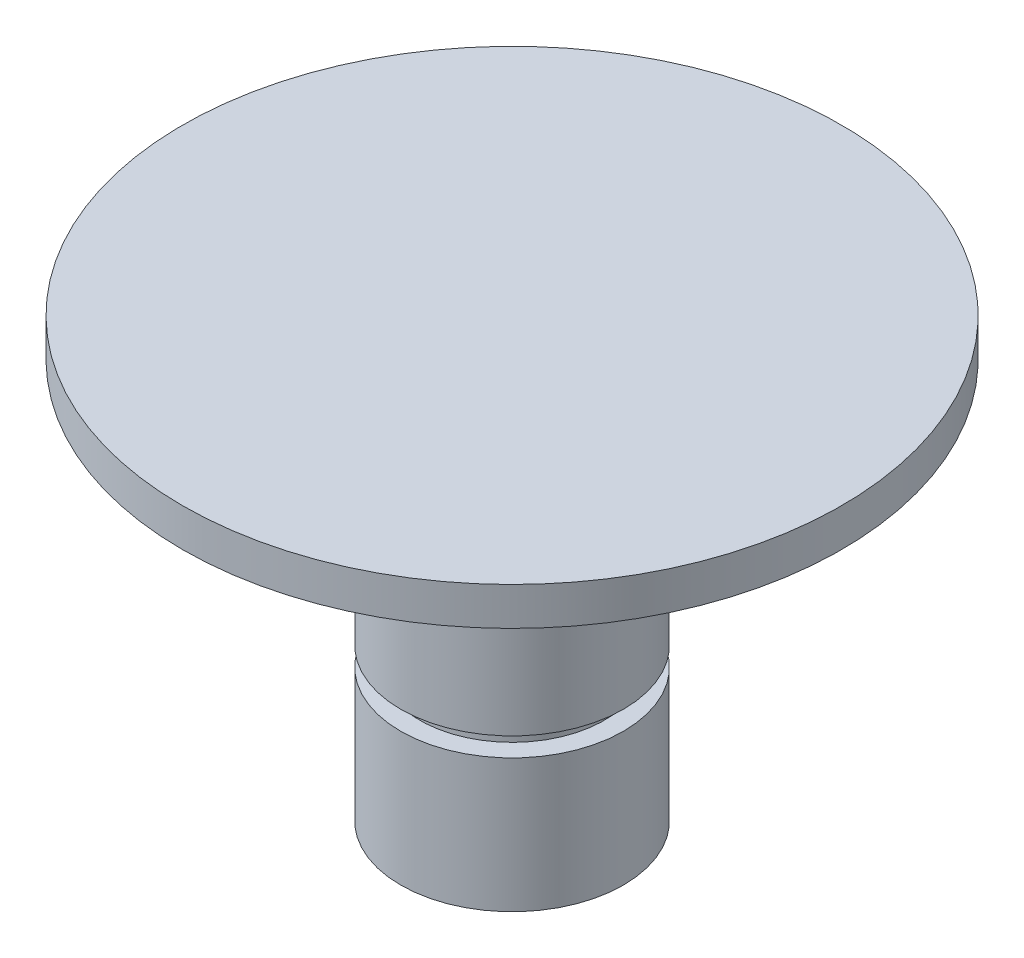
ISO-10303-21;
HEADER;
FILE_DESCRIPTION(('STEP AP214'),'2;1');
FILE_NAME('part.step','',(''),(''),'','','');
FILE_SCHEMA(('AUTOMOTIVE_DESIGN { 1 0 10303 214 1 1 1 1 }'));
ENDSEC;
DATA;
#1=APPLICATION_CONTEXT('core data for automotive mechanical design processes');
#2=APPLICATION_PROTOCOL_DEFINITION('international standard','automotive_design',2000,#1);
#3=PRODUCT_CONTEXT('',#1,'mechanical');
#4=PRODUCT('Part','Part','',(#3));
#5=PRODUCT_RELATED_PRODUCT_CATEGORY('part','',(#4));
#6=PRODUCT_DEFINITION_FORMATION('','',#4);
#7=PRODUCT_DEFINITION_CONTEXT('part definition',#1,'design');
#8=PRODUCT_DEFINITION('design','',#6,#7);
#9=PRODUCT_DEFINITION_SHAPE('','',#8);
#10=(LENGTH_UNIT() NAMED_UNIT(*) SI_UNIT(.MILLI.,.METRE.));
#11=(NAMED_UNIT(*) PLANE_ANGLE_UNIT() SI_UNIT($,.RADIAN.));
#12=(NAMED_UNIT(*) SI_UNIT($,.STERADIAN.) SOLID_ANGLE_UNIT());
#13=UNCERTAINTY_MEASURE_WITH_UNIT(LENGTH_MEASURE(1.E-05),#10,'distance_accuracy_value','');
#14=(GEOMETRIC_REPRESENTATION_CONTEXT(3) GLOBAL_UNCERTAINTY_ASSIGNED_CONTEXT((#13)) GLOBAL_UNIT_ASSIGNED_CONTEXT((#10,
#11,#12)) REPRESENTATION_CONTEXT('',''));
#15=CARTESIAN_POINT('',(0.,0.,0.));
#16=DIRECTION('',(0.,0.,1.));
#17=DIRECTION('',(1.,0.,0.));
#18=AXIS2_PLACEMENT_3D('',#15,#16,#17);
#19=CARTESIAN_POINT('',(0.,21.,0.));
#20=DIRECTION('',(0.,-1.,0.));
#21=DIRECTION('',(0.,0.,-1.));
#22=AXIS2_PLACEMENT_3D('',#19,#20,#21);
#23=CYLINDRICAL_SURFACE('',#22,5.85);
#24=CARTESIAN_POINT('',(0.,18.,0.));
#25=DIRECTION('',(0.,-1.,0.));
#26=DIRECTION('',(0.,0.,-1.));
#27=AXIS2_PLACEMENT_3D('',#24,#25,#26);
#28=CIRCLE('',#27,5.85);
#29=CARTESIAN_POINT('',(0.,18.,-5.85));
#30=VERTEX_POINT('',#29);
#31=EDGE_CURVE('E82',#30,#30,#28,.T.);
#32=CARTESIAN_POINT('',(0.,8.,0.));
#33=DIRECTION('',(0.,-1.,0.));
#34=DIRECTION('',(0.,0.,-1.));
#35=AXIS2_PLACEMENT_3D('',#32,#33,#34);
#36=CIRCLE('',#35,5.85);
#37=CARTESIAN_POINT('',(0.,8.,-5.85));
#38=VERTEX_POINT('',#37);
#39=EDGE_CURVE('E62',#38,#38,#36,.T.);
#40=CARTESIAN_POINT('',(0.,18.,-5.85));
#41=CARTESIAN_POINT('',(0.,17.8958333333333,-5.85));
#42=CARTESIAN_POINT('',(0.,17.7916666666667,-5.85));
#43=CARTESIAN_POINT('',(0.,17.5833333333333,-5.85));
#44=CARTESIAN_POINT('',(0.,17.4791666666667,-5.85));
#45=CARTESIAN_POINT('',(0.,17.2708333333333,-5.85));
#46=CARTESIAN_POINT('',(0.,17.1666666666667,-5.85));
#47=CARTESIAN_POINT('',(0.,16.9583333333333,-5.85));
#48=CARTESIAN_POINT('',(0.,16.8541666666667,-5.85));
#49=CARTESIAN_POINT('',(0.,16.6458333333333,-5.85));
#50=CARTESIAN_POINT('',(0.,16.5416666666667,-5.85));
#51=CARTESIAN_POINT('',(0.,16.3333333333333,-5.85));
#52=CARTESIAN_POINT('',(0.,16.2291666666667,-5.85));
#53=CARTESIAN_POINT('',(0.,16.0208333333333,-5.85));
#54=CARTESIAN_POINT('',(0.,15.9166666666667,-5.85));
#55=CARTESIAN_POINT('',(0.,15.7083333333333,-5.85));
#56=CARTESIAN_POINT('',(0.,15.6041666666667,-5.85));
#57=CARTESIAN_POINT('',(0.,15.3958333333333,-5.85));
#58=CARTESIAN_POINT('',(0.,15.2916666666667,-5.85));
#59=CARTESIAN_POINT('',(0.,15.0833333333333,-5.85));
#60=CARTESIAN_POINT('',(0.,14.9791666666667,-5.85));
#61=CARTESIAN_POINT('',(0.,14.7708333333333,-5.85));
#62=CARTESIAN_POINT('',(0.,14.6666666666667,-5.85));
#63=CARTESIAN_POINT('',(0.,14.4583333333333,-5.85));
#64=CARTESIAN_POINT('',(0.,14.3541666666667,-5.85));
#65=CARTESIAN_POINT('',(0.,14.1458333333333,-5.85));
#66=CARTESIAN_POINT('',(0.,14.0416666666667,-5.85));
#67=CARTESIAN_POINT('',(0.,13.8333333333333,-5.85));
#68=CARTESIAN_POINT('',(0.,13.7291666666667,-5.85));
#69=CARTESIAN_POINT('',(0.,13.5208333333333,-5.85));
#70=CARTESIAN_POINT('',(0.,13.4166666666667,-5.85));
#71=CARTESIAN_POINT('',(0.,13.2083333333333,-5.85));
#72=CARTESIAN_POINT('',(0.,13.1041666666667,-5.85));
#73=CARTESIAN_POINT('',(0.,12.8958333333333,-5.85));
#74=CARTESIAN_POINT('',(0.,12.7916666666667,-5.85));
#75=CARTESIAN_POINT('',(0.,12.5833333333333,-5.85));
#76=CARTESIAN_POINT('',(0.,12.4791666666667,-5.85));
#77=CARTESIAN_POINT('',(0.,12.2708333333333,-5.85));
#78=CARTESIAN_POINT('',(0.,12.1666666666667,-5.85));
#79=CARTESIAN_POINT('',(0.,11.9583333333333,-5.85));
#80=CARTESIAN_POINT('',(0.,11.8541666666667,-5.85));
#81=CARTESIAN_POINT('',(0.,11.6458333333333,-5.85));
#82=CARTESIAN_POINT('',(0.,11.5416666666667,-5.85));
#83=CARTESIAN_POINT('',(0.,11.3333333333333,-5.85));
#84=CARTESIAN_POINT('',(0.,11.2291666666667,-5.85));
#85=CARTESIAN_POINT('',(0.,11.0208333333333,-5.85));
#86=CARTESIAN_POINT('',(0.,10.9166666666667,-5.85));
#87=CARTESIAN_POINT('',(0.,10.7083333333333,-5.85));
#88=CARTESIAN_POINT('',(0.,10.6041666666667,-5.85));
#89=CARTESIAN_POINT('',(0.,10.3958333333333,-5.85));
#90=CARTESIAN_POINT('',(0.,10.2916666666667,-5.85));
#91=CARTESIAN_POINT('',(0.,10.0833333333333,-5.85));
#92=CARTESIAN_POINT('',(0.,9.97916666666667,-5.85));
#93=CARTESIAN_POINT('',(0.,9.77083333333334,-5.85));
#94=CARTESIAN_POINT('',(0.,9.66666666666667,-5.85));
#95=CARTESIAN_POINT('',(0.,9.45833333333334,-5.85));
#96=CARTESIAN_POINT('',(0.,9.35416666666667,-5.85));
#97=CARTESIAN_POINT('',(0.,9.14583333333334,-5.85));
#98=CARTESIAN_POINT('',(0.,9.04166666666667,-5.85));
#99=CARTESIAN_POINT('',(0.,8.83333333333334,-5.85));
#100=CARTESIAN_POINT('',(0.,8.72916666666667,-5.85));
#101=CARTESIAN_POINT('',(0.,8.52083333333334,-5.85));
#102=CARTESIAN_POINT('',(0.,8.41666666666667,-5.85));
#103=CARTESIAN_POINT('',(0.,8.20833333333334,-5.85));
#104=CARTESIAN_POINT('',(0.,8.10416666666667,-5.85));
#105=CARTESIAN_POINT('',(0.,8.,-5.85));
#106=B_SPLINE_CURVE_WITH_KNOTS('',3,(#40,#41,#42,#43,#44,#45,#46,#47,#48,#49,#50,#51,#52,#53,
#54,#55,#56,#57,#58,#59,#60,#61,#62,#63,#64,#65,#66,#67,#68,#69,#70,#71,#72,#73,#74,#75,#76,#77,
#78,#79,#80,#81,#82,#83,#84,#85,#86,#87,#88,#89,#90,#91,#92,#93,#94,#95,#96,#97,#98,#99,#100,
#101,#102,#103,#104,#105),.UNSPECIFIED.,.F.,.F.,(4,2,2,2,2,2,2,2,2,2,2,2,2,2,2,2,2,2,2,2,2,2,2,
2,2,2,2,2,2,2,2,2,4),(0.,0.3125,0.625000000000001,0.937500000000001,1.25,1.5625,1.875,2.1875,
2.5,2.8125,3.125,3.4375,3.75,4.0625,4.375,4.6875,5.,5.3125,5.625,5.9375,6.25,6.5625,6.875,
7.1875,7.5,7.8125,8.125,8.4375,8.75,9.0625,9.375,9.6875,10.),.UNSPECIFIED.);
#107=EDGE_CURVE('BSEAM41',#30,#38,#106,.T.);
#108=ORIENTED_EDGE('',*,*,#31,.T.);
#109=ORIENTED_EDGE('',*,*,#39,.F.);
#110=ORIENTED_EDGE('',*,*,#107,.T.);
#111=ORIENTED_EDGE('',*,*,#107,.F.);
#112=EDGE_LOOP('',(#108,#110,#109,#111));
#113=FACE_BOUND('',#112,.T.);
#114=ADVANCED_FACE('F41',(#113),#23,.T.);
#115=CARTESIAN_POINT('',(0.,7.,0.));
#116=DIRECTION('',(0.,-1.,0.));
#117=DIRECTION('',(0.,0.,-1.));
#118=AXIS2_PLACEMENT_3D('',#115,#116,#117);
#119=PLANE('',#118);
#120=CARTESIAN_POINT('',(0.,7.,0.));
#121=DIRECTION('',(0.,-1.,0.));
#122=DIRECTION('',(0.,0.,-1.));
#123=AXIS2_PLACEMENT_3D('',#120,#121,#122);
#124=CIRCLE('',#123,5.85);
#125=CARTESIAN_POINT('',(0.,7.,-5.85));
#126=VERTEX_POINT('',#125);
#127=EDGE_CURVE('E60',#126,#126,#124,.T.);
#128=ORIENTED_EDGE('',*,*,#127,.F.);
#129=EDGE_LOOP('',(#128));
#130=FACE_BOUND('',#129,.T.);
#131=CARTESIAN_POINT('',(0.,7.,0.));
#132=DIRECTION('',(0.,-1.,0.));
#133=DIRECTION('',(0.,0.,-1.));
#134=AXIS2_PLACEMENT_3D('',#131,#132,#133);
#135=CIRCLE('',#134,4.85);
#136=CARTESIAN_POINT('',(0.,7.,-4.85));
#137=VERTEX_POINT('',#136);
#138=EDGE_CURVE('E65',#137,#137,#135,.T.);
#139=ORIENTED_EDGE('',*,*,#138,.T.);
#140=EDGE_LOOP('',(#139));
#141=FACE_BOUND('',#140,.T.);
#142=ADVANCED_FACE('F105',(#130,#141),#119,.F.);
#143=CARTESIAN_POINT('',(0.,8.,0.));
#144=DIRECTION('',(0.,-1.,0.));
#145=DIRECTION('',(0.,0.,-1.));
#146=AXIS2_PLACEMENT_3D('',#143,#144,#145);
#147=PLANE('',#146);
#148=ORIENTED_EDGE('',*,*,#39,.T.);
#149=EDGE_LOOP('',(#148));
#150=FACE_BOUND('',#149,.T.);
#151=CARTESIAN_POINT('',(0.,8.,0.));
#152=DIRECTION('',(0.,-1.,0.));
#153=DIRECTION('',(0.,0.,-1.));
#154=AXIS2_PLACEMENT_3D('',#151,#152,#153);
#155=CIRCLE('',#154,4.85);
#156=CARTESIAN_POINT('',(0.,8.,-4.85));
#157=VERTEX_POINT('',#156);
#158=EDGE_CURVE('E68',#157,#157,#155,.T.);
#159=ORIENTED_EDGE('',*,*,#158,.F.);
#160=EDGE_LOOP('',(#159));
#161=FACE_BOUND('',#160,.T.);
#162=ADVANCED_FACE('F109',(#150,#161),#147,.T.);
#163=CARTESIAN_POINT('',(0.,7.,0.));
#164=DIRECTION('',(0.,1.,0.));
#165=DIRECTION('',(0.,0.,1.));
#166=AXIS2_PLACEMENT_3D('',#163,#164,#165);
#167=CYLINDRICAL_SURFACE('',#166,4.85);
#168=ORIENTED_EDGE('',*,*,#138,.F.);
#169=EDGE_LOOP('',(#168));
#170=FACE_BOUND('',#169,.T.);
#171=ORIENTED_EDGE('',*,*,#158,.T.);
#172=EDGE_LOOP('',(#171));
#173=FACE_BOUND('',#172,.T.);
#174=ADVANCED_FACE('F121',(#170,#173),#167,.T.);
#175=CARTESIAN_POINT('',(0.,0.,0.));
#176=DIRECTION('',(0.,1.,0.));
#177=DIRECTION('',(0.,0.,1.));
#178=AXIS2_PLACEMENT_3D('',#175,#176,#177);
#179=PLANE('',#178);
#180=CARTESIAN_POINT('',(0.,0.,0.));
#181=DIRECTION('',(0.,-1.,0.));
#182=DIRECTION('',(0.,0.,-1.));
#183=AXIS2_PLACEMENT_3D('',#180,#181,#182);
#184=CIRCLE('',#183,1.5);
#185=CARTESIAN_POINT('',(0.,0.,-1.5));
#186=VERTEX_POINT('',#185);
#187=EDGE_CURVE('E74',#186,#186,#184,.T.);
#188=ORIENTED_EDGE('',*,*,#187,.F.);
#189=EDGE_LOOP('',(#188));
#190=FACE_BOUND('',#189,.T.);
#191=CARTESIAN_POINT('',(0.,0.,0.));
#192=DIRECTION('',(0.,1.,0.));
#193=DIRECTION('',(0.,0.,1.));
#194=AXIS2_PLACEMENT_3D('',#191,#192,#193);
#195=CIRCLE('',#194,5.85);
#196=CARTESIAN_POINT('',(0.,0.,-5.85));
#197=VERTEX_POINT('',#196);
#198=EDGE_CURVE('E48',#197,#197,#195,.T.);
#199=ORIENTED_EDGE('',*,*,#198,.F.);
#200=EDGE_LOOP('',(#199));
#201=FACE_BOUND('',#200,.T.);
#202=ADVANCED_FACE('F113',(#190,#201),#179,.F.);
#203=CARTESIAN_POINT('',(0.,7.,-5.85));
#204=CARTESIAN_POINT('',(0.,6.92708333333333,-5.85));
#205=CARTESIAN_POINT('',(0.,6.85416666666667,-5.85));
#206=CARTESIAN_POINT('',(0.,6.70833333333333,-5.85));
#207=CARTESIAN_POINT('',(0.,6.63541666666667,-5.85));
#208=CARTESIAN_POINT('',(0.,6.48958333333333,-5.85));
#209=CARTESIAN_POINT('',(0.,6.41666666666667,-5.85));
#210=CARTESIAN_POINT('',(0.,6.27083333333333,-5.85));
#211=CARTESIAN_POINT('',(0.,6.19791666666667,-5.85));
#212=CARTESIAN_POINT('',(0.,6.05208333333333,-5.85));
#213=CARTESIAN_POINT('',(0.,5.97916666666667,-5.85));
#214=CARTESIAN_POINT('',(0.,5.83333333333333,-5.85));
#215=CARTESIAN_POINT('',(0.,5.76041666666667,-5.85));
#216=CARTESIAN_POINT('',(0.,5.61458333333333,-5.85));
#217=CARTESIAN_POINT('',(0.,5.54166666666667,-5.85));
#218=CARTESIAN_POINT('',(0.,5.39583333333333,-5.85));
#219=CARTESIAN_POINT('',(0.,5.32291666666667,-5.85));
#220=CARTESIAN_POINT('',(0.,5.17708333333333,-5.85));
#221=CARTESIAN_POINT('',(0.,5.10416666666667,-5.85));
#222=CARTESIAN_POINT('',(0.,4.95833333333333,-5.85));
#223=CARTESIAN_POINT('',(0.,4.88541666666667,-5.85));
#224=CARTESIAN_POINT('',(0.,4.73958333333333,-5.85));
#225=CARTESIAN_POINT('',(0.,4.66666666666667,-5.85));
#226=CARTESIAN_POINT('',(0.,4.52083333333333,-5.85));
#227=CARTESIAN_POINT('',(0.,4.44791666666667,-5.85));
#228=CARTESIAN_POINT('',(0.,4.30208333333333,-5.85));
#229=CARTESIAN_POINT('',(0.,4.22916666666667,-5.85));
#230=CARTESIAN_POINT('',(0.,4.08333333333333,-5.85));
#231=CARTESIAN_POINT('',(0.,4.01041666666667,-5.85));
#232=CARTESIAN_POINT('',(0.,3.86458333333334,-5.85));
#233=CARTESIAN_POINT('',(0.,3.79166666666667,-5.85));
#234=CARTESIAN_POINT('',(0.,3.64583333333333,-5.85));
#235=CARTESIAN_POINT('',(0.,3.57291666666667,-5.85));
#236=CARTESIAN_POINT('',(0.,3.42708333333334,-5.85));
#237=CARTESIAN_POINT('',(0.,3.35416666666667,-5.85));
#238=CARTESIAN_POINT('',(0.,3.20833333333333,-5.85));
#239=CARTESIAN_POINT('',(0.,3.13541666666667,-5.85));
#240=CARTESIAN_POINT('',(0.,2.98958333333333,-5.85));
#241=CARTESIAN_POINT('',(0.,2.91666666666667,-5.85));
#242=CARTESIAN_POINT('',(0.,2.77083333333333,-5.85));
#243=CARTESIAN_POINT('',(0.,2.69791666666667,-5.85));
#244=CARTESIAN_POINT('',(0.,2.55208333333334,-5.85));
#245=CARTESIAN_POINT('',(0.,2.47916666666667,-5.85));
#246=CARTESIAN_POINT('',(0.,2.33333333333334,-5.85));
#247=CARTESIAN_POINT('',(0.,2.26041666666667,-5.85));
#248=CARTESIAN_POINT('',(0.,2.11458333333334,-5.85));
#249=CARTESIAN_POINT('',(0.,2.04166666666667,-5.85));
#250=CARTESIAN_POINT('',(0.,1.89583333333334,-5.85));
#251=CARTESIAN_POINT('',(0.,1.82291666666667,-5.85));
#252=CARTESIAN_POINT('',(0.,1.67708333333333,-5.85));
#253=CARTESIAN_POINT('',(0.,1.60416666666667,-5.85));
#254=CARTESIAN_POINT('',(0.,1.45833333333333,-5.85));
#255=CARTESIAN_POINT('',(0.,1.38541666666667,-5.85));
#256=CARTESIAN_POINT('',(0.,1.23958333333333,-5.85));
#257=CARTESIAN_POINT('',(0.,1.16666666666667,-5.85));
#258=CARTESIAN_POINT('',(0.,1.02083333333333,-5.85));
#259=CARTESIAN_POINT('',(0.,0.947916666666667,-5.85));
#260=CARTESIAN_POINT('',(0.,0.802083333333334,-5.85));
#261=CARTESIAN_POINT('',(0.,0.729166666666667,-5.85));
#262=CARTESIAN_POINT('',(0.,0.583333333333334,-5.85));
#263=CARTESIAN_POINT('',(0.,0.510416666666667,-5.85));
#264=CARTESIAN_POINT('',(0.,0.364583333333334,-5.85));
#265=CARTESIAN_POINT('',(0.,0.291666666666667,-5.85));
#266=CARTESIAN_POINT('',(0.,0.145833333333333,-5.85));
#267=CARTESIAN_POINT('',(0.,0.0729166666666666,-5.85));
#268=CARTESIAN_POINT('',(0.,0.,-5.85));
#269=B_SPLINE_CURVE_WITH_KNOTS('',3,(#203,#204,#205,#206,#207,#208,#209,#210,#211,#212,#213,
#214,#215,#216,#217,#218,#219,#220,#221,#222,#223,#224,#225,#226,#227,#228,#229,#230,#231,#232,
#233,#234,#235,#236,#237,#238,#239,#240,#241,#242,#243,#244,#245,#246,#247,#248,#249,#250,#251,
#252,#253,#254,#255,#256,#257,#258,#259,#260,#261,#262,#263,#264,#265,#266,#267,#268),
.UNSPECIFIED.,.F.,.F.,(4,2,2,2,2,2,2,2,2,2,2,2,2,2,2,2,2,2,2,2,2,2,2,2,2,2,2,2,2,2,2,2,4),(0.,
0.21875,0.4375,0.656250000000001,0.875000000000001,1.09375,1.3125,1.53125,1.75,1.96875,2.1875,
2.40625,2.625,2.84375,3.0625,3.28125,3.5,3.71875,3.9375,4.15625,4.375,4.59375,4.8125,5.03125,
5.25,5.46875,5.6875,5.90625,6.125,6.34375,6.5625,6.78125,7.),.UNSPECIFIED.);
#270=EDGE_CURVE('BSEAM43',#126,#197,#269,.T.);
#271=ORIENTED_EDGE('',*,*,#127,.T.);
#272=ORIENTED_EDGE('',*,*,#198,.T.);
#273=ORIENTED_EDGE('',*,*,#270,.T.);
#274=ORIENTED_EDGE('',*,*,#270,.F.);
#275=EDGE_LOOP('',(#271,#273,#272,#274));
#276=FACE_BOUND('',#275,.T.);
#277=ADVANCED_FACE('F43',(#276),#23,.T.);
#278=CARTESIAN_POINT('',(0.,5.,0.));
#279=DIRECTION('',(0.,-1.,0.));
#280=DIRECTION('',(0.,0.,-1.));
#281=AXIS2_PLACEMENT_3D('',#278,#279,#280);
#282=CYLINDRICAL_SURFACE('',#281,1.5);
#283=CARTESIAN_POINT('',(0.,5.,0.));
#284=DIRECTION('',(0.,-1.,0.));
#285=DIRECTION('',(0.,0.,-1.));
#286=AXIS2_PLACEMENT_3D('',#283,#284,#285);
#287=CIRCLE('',#286,1.5);
#288=CARTESIAN_POINT('',(0.,5.,-1.5));
#289=VERTEX_POINT('',#288);
#290=EDGE_CURVE('E71',#289,#289,#287,.T.);
#291=ORIENTED_EDGE('',*,*,#290,.F.);
#292=EDGE_LOOP('',(#291));
#293=FACE_BOUND('',#292,.T.);
#294=ORIENTED_EDGE('',*,*,#187,.T.);
#295=EDGE_LOOP('',(#294));
#296=FACE_BOUND('',#295,.T.);
#297=ADVANCED_FACE('F101',(#293,#296),#282,.F.);
#298=CARTESIAN_POINT('',(0.,5.,0.));
#299=DIRECTION('',(0.,-1.,0.));
#300=DIRECTION('',(0.,0.,-1.));
#301=AXIS2_PLACEMENT_3D('',#298,#299,#300);
#302=PLANE('',#301);
#303=ORIENTED_EDGE('',*,*,#290,.T.);
#304=EDGE_LOOP('',(#303));
#305=FACE_BOUND('',#304,.T.);
#306=ADVANCED_FACE('F91',(#305),#302,.T.);
#307=CARTESIAN_POINT('',(0.,18.,0.));
#308=DIRECTION('',(0.,-1.,0.));
#309=DIRECTION('',(0.,0.,-1.));
#310=AXIS2_PLACEMENT_3D('',#307,#308,#309);
#311=PLANE('',#310);
#312=CARTESIAN_POINT('',(0.,18.,0.));
#313=DIRECTION('',(0.,-1.,0.));
#314=DIRECTION('',(0.,0.,-1.));
#315=AXIS2_PLACEMENT_3D('',#312,#313,#314);
#316=CIRCLE('',#315,8.85);
#317=CARTESIAN_POINT('',(0.,18.,-8.85));
#318=VERTEX_POINT('',#317);
#319=EDGE_CURVE('E77',#318,#318,#316,.T.);
#320=ORIENTED_EDGE('',*,*,#319,.T.);
#321=EDGE_LOOP('',(#320));
#322=FACE_BOUND('',#321,.T.);
#323=ORIENTED_EDGE('',*,*,#31,.F.);
#324=EDGE_LOOP('',(#323));
#325=FACE_BOUND('',#324,.T.);
#326=ADVANCED_FACE('F88',(#322,#325),#311,.T.);
#327=CARTESIAN_POINT('',(0.,18.,0.));
#328=DIRECTION('',(0.,1.,0.));
#329=DIRECTION('',(0.,0.,1.));
#330=AXIS2_PLACEMENT_3D('',#327,#328,#329);
#331=CYLINDRICAL_SURFACE('',#330,8.85);
#332=ORIENTED_EDGE('',*,*,#319,.F.);
#333=EDGE_LOOP('',(#332));
#334=FACE_BOUND('',#333,.T.);
#335=CARTESIAN_POINT('',(0.,21.,0.));
#336=DIRECTION('',(0.,1.,0.));
#337=DIRECTION('',(0.,0.,1.));
#338=AXIS2_PLACEMENT_3D('',#335,#336,#337);
#339=CIRCLE('',#338,8.85);
#340=CARTESIAN_POINT('',(0.,21.,8.85));
#341=VERTEX_POINT('',#340);
#342=EDGE_CURVE('E10',#341,#341,#339,.F.);
#343=ORIENTED_EDGE('',*,*,#342,.T.);
#344=EDGE_LOOP('',(#343));
#345=FACE_BOUND('',#344,.T.);
#346=ADVANCED_FACE('F90',(#334,#345),#331,.T.);
#347=CARTESIAN_POINT('',(0.,23.,0.));
#348=DIRECTION('',(0.,1.,0.));
#349=DIRECTION('',(0.,0.,1.));
#350=AXIS2_PLACEMENT_3D('',#347,#348,#349);
#351=PLANE('',#350);
#352=CARTESIAN_POINT('',(0.,23.,0.));
#353=DIRECTION('',(0.,1.,0.));
#354=DIRECTION('',(0.,0.,1.));
#355=AXIS2_PLACEMENT_3D('',#352,#353,#354);
#356=CIRCLE('',#355,17.3163921411988);
#357=CARTESIAN_POINT('',(0.,23.,17.3163921411988));
#358=VERTEX_POINT('',#357);
#359=EDGE_CURVE('E52',#358,#358,#356,.T.);
#360=ORIENTED_EDGE('',*,*,#359,.T.);
#361=EDGE_LOOP('',(#360));
#362=FACE_BOUND('',#361,.T.);
#363=ADVANCED_FACE('F98',(#362),#351,.T.);
#364=CARTESIAN_POINT('',(0.,23.,0.));
#365=DIRECTION('',(0.,-1.,0.));
#366=DIRECTION('',(0.,0.,-1.));
#367=AXIS2_PLACEMENT_3D('',#364,#365,#366);
#368=CYLINDRICAL_SURFACE('',#367,17.3163921411988);
#369=ORIENTED_EDGE('',*,*,#359,.F.);
#370=EDGE_LOOP('',(#369));
#371=FACE_BOUND('',#370,.T.);
#372=CARTESIAN_POINT('',(0.,21.,0.));
#373=DIRECTION('',(0.,1.,0.));
#374=DIRECTION('',(0.,0.,1.));
#375=AXIS2_PLACEMENT_3D('',#372,#373,#374);
#376=CIRCLE('',#375,17.3163921411988);
#377=CARTESIAN_POINT('',(0.,21.,17.3163921411988));
#378=VERTEX_POINT('',#377);
#379=EDGE_CURVE('E56',#378,#378,#376,.T.);
#380=ORIENTED_EDGE('',*,*,#379,.T.);
#381=EDGE_LOOP('',(#380));
#382=FACE_BOUND('',#381,.T.);
#383=ADVANCED_FACE('F140',(#371,#382),#368,.T.);
#384=CARTESIAN_POINT('',(0.,21.,0.));
#385=DIRECTION('',(0.,1.,0.));
#386=DIRECTION('',(0.,0.,1.));
#387=AXIS2_PLACEMENT_3D('',#384,#385,#386);
#388=PLANE('',#387);
#389=ORIENTED_EDGE('',*,*,#379,.F.);
#390=EDGE_LOOP('',(#389));
#391=FACE_BOUND('',#390,.T.);
#392=ORIENTED_EDGE('',*,*,#342,.F.);
#393=EDGE_LOOP('',(#392));
#394=FACE_BOUND('',#393,.T.);
#395=ADVANCED_FACE('F142',(#391,#394),#388,.F.);
#396=CLOSED_SHELL('',(#114,#142,#162,#174,#202,#277,#297,#306,#326,#346,#363,#383,#395));
#397=MANIFOLD_SOLID_BREP('B2',#396);
#398=ADVANCED_BREP_SHAPE_REPRESENTATION('',(#18,#397),#14);
#399=SHAPE_DEFINITION_REPRESENTATION(#9,#398);
ENDSEC;
END-ISO-10303-21;
